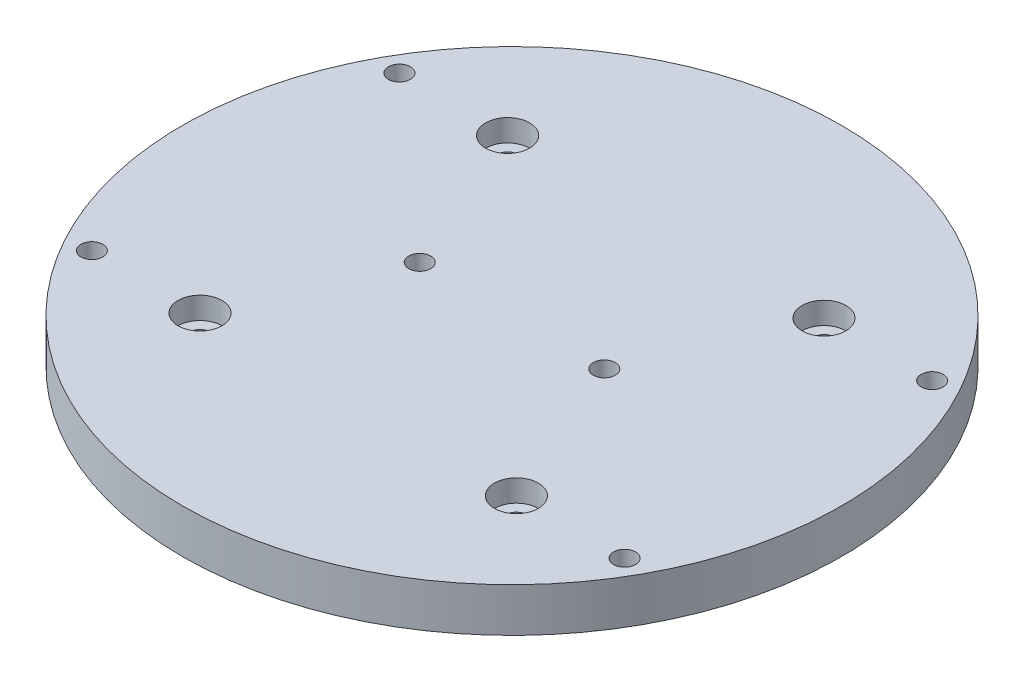
ISO-10303-21;
HEADER;
FILE_DESCRIPTION(('STEP AP214'),'2;1');
FILE_NAME('part.step','',(''),(''),'','','');
FILE_SCHEMA(('AUTOMOTIVE_DESIGN { 1 0 10303 214 1 1 1 1 }'));
ENDSEC;
DATA;
#1=APPLICATION_CONTEXT('core data for automotive mechanical design processes');
#2=APPLICATION_PROTOCOL_DEFINITION('international standard','automotive_design',2000,#1);
#3=PRODUCT_CONTEXT('',#1,'mechanical');
#4=PRODUCT('Part','Part','',(#3));
#5=PRODUCT_RELATED_PRODUCT_CATEGORY('part','',(#4));
#6=PRODUCT_DEFINITION_FORMATION('','',#4);
#7=PRODUCT_DEFINITION_CONTEXT('part definition',#1,'design');
#8=PRODUCT_DEFINITION('design','',#6,#7);
#9=PRODUCT_DEFINITION_SHAPE('','',#8);
#10=(LENGTH_UNIT() NAMED_UNIT(*) SI_UNIT(.MILLI.,.METRE.));
#11=(NAMED_UNIT(*) PLANE_ANGLE_UNIT() SI_UNIT($,.RADIAN.));
#12=(NAMED_UNIT(*) SI_UNIT($,.STERADIAN.) SOLID_ANGLE_UNIT());
#13=UNCERTAINTY_MEASURE_WITH_UNIT(LENGTH_MEASURE(1.E-05),#10,'distance_accuracy_value','');
#14=(GEOMETRIC_REPRESENTATION_CONTEXT(3) GLOBAL_UNCERTAINTY_ASSIGNED_CONTEXT((#13)) GLOBAL_UNIT_ASSIGNED_CONTEXT((#10,
#11,#12)) REPRESENTATION_CONTEXT('',''));
#15=CARTESIAN_POINT('',(0.,0.,0.));
#16=DIRECTION('',(0.,0.,1.));
#17=DIRECTION('',(1.,0.,0.));
#18=AXIS2_PLACEMENT_3D('',#15,#16,#17);
#19=CARTESIAN_POINT('',(36.,-17.,-35.));
#20=DIRECTION('',(0.,1.,0.));
#21=DIRECTION('',(0.,0.,1.));
#22=AXIS2_PLACEMENT_3D('',#19,#20,#21);
#23=CYLINDRICAL_SURFACE('',#22,2.5);
#24=CARTESIAN_POINT('',(36.,0.,-35.));
#25=DIRECTION('',(0.,1.,0.));
#26=DIRECTION('',(0.,0.,1.));
#27=AXIS2_PLACEMENT_3D('',#24,#25,#26);
#28=CIRCLE('',#27,2.5);
#29=CARTESIAN_POINT('',(36.,0.,-32.5));
#30=VERTEX_POINT('',#29);
#31=EDGE_CURVE('E61',#30,#30,#28,.T.);
#32=ORIENTED_EDGE('',*,*,#31,.F.);
#33=EDGE_LOOP('',(#32));
#34=FACE_BOUND('',#33,.T.);
#35=CARTESIAN_POINT('',(36.,5.,-35.));
#36=DIRECTION('',(0.,1.,0.));
#37=DIRECTION('',(0.,0.,1.));
#38=AXIS2_PLACEMENT_3D('',#35,#36,#37);
#39=CIRCLE('',#38,2.5);
#40=CARTESIAN_POINT('',(36.,5.,-32.5));
#41=VERTEX_POINT('',#40);
#42=EDGE_CURVE('E37',#41,#41,#39,.F.);
#43=ORIENTED_EDGE('',*,*,#42,.F.);
#44=EDGE_LOOP('',(#43));
#45=FACE_BOUND('',#44,.T.);
#46=ADVANCED_FACE('F33',(#34,#45),#23,.F.);
#47=CARTESIAN_POINT('',(36.,-17.,35.));
#48=DIRECTION('',(0.,1.,0.));
#49=DIRECTION('',(0.,0.,1.));
#50=AXIS2_PLACEMENT_3D('',#47,#48,#49);
#51=CYLINDRICAL_SURFACE('',#50,2.5);
#52=CARTESIAN_POINT('',(36.,0.,35.));
#53=DIRECTION('',(0.,1.,0.));
#54=DIRECTION('',(0.,0.,1.));
#55=AXIS2_PLACEMENT_3D('',#52,#53,#54);
#56=CIRCLE('',#55,2.5);
#57=CARTESIAN_POINT('',(36.,0.,37.5));
#58=VERTEX_POINT('',#57);
#59=EDGE_CURVE('E64',#58,#58,#56,.T.);
#60=ORIENTED_EDGE('',*,*,#59,.F.);
#61=EDGE_LOOP('',(#60));
#62=FACE_BOUND('',#61,.T.);
#63=CARTESIAN_POINT('',(36.,5.,35.));
#64=DIRECTION('',(0.,1.,0.));
#65=DIRECTION('',(0.,0.,1.));
#66=AXIS2_PLACEMENT_3D('',#63,#64,#65);
#67=CIRCLE('',#66,2.5);
#68=CARTESIAN_POINT('',(36.,5.,37.5));
#69=VERTEX_POINT('',#68);
#70=EDGE_CURVE('E87',#69,#69,#67,.F.);
#71=ORIENTED_EDGE('',*,*,#70,.F.);
#72=EDGE_LOOP('',(#71));
#73=FACE_BOUND('',#72,.T.);
#74=ADVANCED_FACE('F139',(#62,#73),#51,.F.);
#75=CARTESIAN_POINT('',(-36.,-17.,35.));
#76=DIRECTION('',(0.,1.,0.));
#77=DIRECTION('',(0.,0.,1.));
#78=AXIS2_PLACEMENT_3D('',#75,#76,#77);
#79=CYLINDRICAL_SURFACE('',#78,2.5);
#80=CARTESIAN_POINT('',(-36.,0.,35.));
#81=DIRECTION('',(0.,1.,0.));
#82=DIRECTION('',(0.,0.,1.));
#83=AXIS2_PLACEMENT_3D('',#80,#81,#82);
#84=CIRCLE('',#83,2.5);
#85=CARTESIAN_POINT('',(-36.,0.,37.5));
#86=VERTEX_POINT('',#85);
#87=EDGE_CURVE('E67',#86,#86,#84,.T.);
#88=ORIENTED_EDGE('',*,*,#87,.F.);
#89=EDGE_LOOP('',(#88));
#90=FACE_BOUND('',#89,.T.);
#91=CARTESIAN_POINT('',(-36.,5.,35.));
#92=DIRECTION('',(0.,1.,0.));
#93=DIRECTION('',(0.,0.,1.));
#94=AXIS2_PLACEMENT_3D('',#91,#92,#93);
#95=CIRCLE('',#94,2.5);
#96=CARTESIAN_POINT('',(-36.,5.,37.5));
#97=VERTEX_POINT('',#96);
#98=EDGE_CURVE('E84',#97,#97,#95,.F.);
#99=ORIENTED_EDGE('',*,*,#98,.F.);
#100=EDGE_LOOP('',(#99));
#101=FACE_BOUND('',#100,.T.);
#102=ADVANCED_FACE('F146',(#90,#101),#79,.F.);
#103=CARTESIAN_POINT('',(-36.,-17.,-35.));
#104=DIRECTION('',(0.,1.,0.));
#105=DIRECTION('',(0.,0.,1.));
#106=AXIS2_PLACEMENT_3D('',#103,#104,#105);
#107=CYLINDRICAL_SURFACE('',#106,2.5);
#108=CARTESIAN_POINT('',(-36.,0.,-35.));
#109=DIRECTION('',(0.,1.,0.));
#110=DIRECTION('',(0.,0.,1.));
#111=AXIS2_PLACEMENT_3D('',#108,#109,#110);
#112=CIRCLE('',#111,2.5);
#113=CARTESIAN_POINT('',(-36.,0.,-32.5));
#114=VERTEX_POINT('',#113);
#115=EDGE_CURVE('E70',#114,#114,#112,.T.);
#116=ORIENTED_EDGE('',*,*,#115,.F.);
#117=EDGE_LOOP('',(#116));
#118=FACE_BOUND('',#117,.T.);
#119=CARTESIAN_POINT('',(-36.,5.,-35.));
#120=DIRECTION('',(0.,1.,0.));
#121=DIRECTION('',(0.,0.,1.));
#122=AXIS2_PLACEMENT_3D('',#119,#120,#121);
#123=CIRCLE('',#122,2.5);
#124=CARTESIAN_POINT('',(-36.,5.,-32.5));
#125=VERTEX_POINT('',#124);
#126=EDGE_CURVE('E81',#125,#125,#123,.F.);
#127=ORIENTED_EDGE('',*,*,#126,.F.);
#128=EDGE_LOOP('',(#127));
#129=FACE_BOUND('',#128,.T.);
#130=ADVANCED_FACE('F133',(#118,#129),#107,.F.);
#131=CARTESIAN_POINT('',(0.,10.,0.));
#132=DIRECTION('',(0.,-1.,0.));
#133=DIRECTION('',(0.,0.,-1.));
#134=AXIS2_PLACEMENT_3D('',#131,#132,#133);
#135=CYLINDRICAL_SURFACE('',#134,75.);
#136=CARTESIAN_POINT('',(0.,10.,0.));
#137=DIRECTION('',(0.,1.,0.));
#138=DIRECTION('',(0.,0.,1.));
#139=AXIS2_PLACEMENT_3D('',#136,#137,#138);
#140=CIRCLE('',#139,75.);
#141=CARTESIAN_POINT('',(0.,10.,75.));
#142=VERTEX_POINT('',#141);
#143=EDGE_CURVE('E10',#142,#142,#140,.T.);
#144=ORIENTED_EDGE('',*,*,#143,.F.);
#145=EDGE_LOOP('',(#144));
#146=FACE_BOUND('',#145,.T.);
#147=CARTESIAN_POINT('',(0.,0.,0.));
#148=DIRECTION('',(0.,1.,0.));
#149=DIRECTION('',(0.,0.,1.));
#150=AXIS2_PLACEMENT_3D('',#147,#148,#149);
#151=CIRCLE('',#150,75.);
#152=CARTESIAN_POINT('',(0.,0.,75.));
#153=VERTEX_POINT('',#152);
#154=EDGE_CURVE('E41',#153,#153,#151,.T.);
#155=ORIENTED_EDGE('',*,*,#154,.T.);
#156=EDGE_LOOP('',(#155));
#157=FACE_BOUND('',#156,.T.);
#158=ADVANCED_FACE('F35',(#146,#157),#135,.T.);
#159=CARTESIAN_POINT('',(0.,10.,0.));
#160=DIRECTION('',(0.,1.,0.));
#161=DIRECTION('',(0.,0.,1.));
#162=AXIS2_PLACEMENT_3D('',#159,#160,#161);
#163=PLANE('',#162);
#164=CARTESIAN_POINT('',(-36.,10.,-35.));
#165=DIRECTION('',(0.,1.,0.));
#166=DIRECTION('',(0.,0.,1.));
#167=AXIS2_PLACEMENT_3D('',#164,#165,#166);
#168=CIRCLE('',#167,5.);
#169=CARTESIAN_POINT('',(-36.,10.,-30.));
#170=VERTEX_POINT('',#169);
#171=EDGE_CURVE('E251',#170,#170,#168,.T.);
#172=ORIENTED_EDGE('',*,*,#171,.F.);
#173=EDGE_LOOP('',(#172));
#174=FACE_BOUND('',#173,.T.);
#175=CARTESIAN_POINT('',(-36.,10.,35.));
#176=DIRECTION('',(0.,1.,0.));
#177=DIRECTION('',(0.,0.,1.));
#178=AXIS2_PLACEMENT_3D('',#175,#176,#177);
#179=CIRCLE('',#178,5.);
#180=CARTESIAN_POINT('',(-36.,10.,39.9999999999999));
#181=VERTEX_POINT('',#180);
#182=EDGE_CURVE('E257',#181,#181,#179,.T.);
#183=ORIENTED_EDGE('',*,*,#182,.F.);
#184=EDGE_LOOP('',(#183));
#185=FACE_BOUND('',#184,.T.);
#186=CARTESIAN_POINT('',(36.,10.,35.));
#187=DIRECTION('',(0.,1.,0.));
#188=DIRECTION('',(0.,0.,1.));
#189=AXIS2_PLACEMENT_3D('',#186,#187,#188);
#190=CIRCLE('',#189,5.);
#191=CARTESIAN_POINT('',(36.,10.,40.));
#192=VERTEX_POINT('',#191);
#193=EDGE_CURVE('E262',#192,#192,#190,.T.);
#194=ORIENTED_EDGE('',*,*,#193,.F.);
#195=EDGE_LOOP('',(#194));
#196=FACE_BOUND('',#195,.T.);
#197=CARTESIAN_POINT('',(36.,10.,-35.));
#198=DIRECTION('',(0.,1.,0.));
#199=DIRECTION('',(0.,0.,1.));
#200=AXIS2_PLACEMENT_3D('',#197,#198,#199);
#201=CIRCLE('',#200,5.);
#202=CARTESIAN_POINT('',(36.,10.,-30.));
#203=VERTEX_POINT('',#202);
#204=EDGE_CURVE('E105',#203,#203,#201,.T.);
#205=ORIENTED_EDGE('',*,*,#204,.F.);
#206=EDGE_LOOP('',(#205));
#207=FACE_BOUND('',#206,.T.);
#208=CARTESIAN_POINT('',(-60.6217782649107,10.,35.));
#209=DIRECTION('',(0.,1.,0.));
#210=DIRECTION('',(0.,0.,1.));
#211=AXIS2_PLACEMENT_3D('',#208,#209,#210);
#212=CIRCLE('',#211,2.5);
#213=CARTESIAN_POINT('',(-60.6217782649107,10.,37.5));
#214=VERTEX_POINT('',#213);
#215=EDGE_CURVE('E96',#214,#214,#212,.T.);
#216=ORIENTED_EDGE('',*,*,#215,.F.);
#217=EDGE_LOOP('',(#216));
#218=FACE_BOUND('',#217,.T.);
#219=CARTESIAN_POINT('',(60.6217782649107,10.,35.0000000000001));
#220=DIRECTION('',(0.,1.,0.));
#221=DIRECTION('',(0.,0.,-1.));
#222=AXIS2_PLACEMENT_3D('',#219,#220,#221);
#223=CIRCLE('',#222,2.5);
#224=CARTESIAN_POINT('',(60.6217782649107,10.,32.5000000000001));
#225=VERTEX_POINT('',#224);
#226=EDGE_CURVE('E101',#225,#225,#223,.T.);
#227=ORIENTED_EDGE('',*,*,#226,.F.);
#228=EDGE_LOOP('',(#227));
#229=FACE_BOUND('',#228,.T.);
#230=CARTESIAN_POINT('',(60.6217782649107,10.,-35.0000000000001));
#231=DIRECTION('',(0.,1.,0.));
#232=DIRECTION('',(0.,0.,1.));
#233=AXIS2_PLACEMENT_3D('',#230,#231,#232);
#234=CIRCLE('',#233,2.5);
#235=CARTESIAN_POINT('',(60.6217782649107,10.,-32.5000000000001));
#236=VERTEX_POINT('',#235);
#237=EDGE_CURVE('E107',#236,#236,#234,.T.);
#238=ORIENTED_EDGE('',*,*,#237,.F.);
#239=EDGE_LOOP('',(#238));
#240=FACE_BOUND('',#239,.T.);
#241=CARTESIAN_POINT('',(-21.,10.,0.));
#242=DIRECTION('',(0.,1.,0.));
#243=DIRECTION('',(0.,0.,1.));
#244=AXIS2_PLACEMENT_3D('',#241,#242,#243);
#245=CIRCLE('',#244,2.5);
#246=CARTESIAN_POINT('',(-21.,10.,2.5));
#247=VERTEX_POINT('',#246);
#248=EDGE_CURVE('E110',#247,#247,#245,.T.);
#249=ORIENTED_EDGE('',*,*,#248,.F.);
#250=EDGE_LOOP('',(#249));
#251=FACE_BOUND('',#250,.T.);
#252=CARTESIAN_POINT('',(-60.6217782649107,10.,-35.0000000000001));
#253=DIRECTION('',(0.,1.,0.));
#254=DIRECTION('',(0.,0.,-1.));
#255=AXIS2_PLACEMENT_3D('',#252,#253,#254);
#256=CIRCLE('',#255,2.5);
#257=CARTESIAN_POINT('',(-60.6217782649107,10.,-37.5000000000001));
#258=VERTEX_POINT('',#257);
#259=EDGE_CURVE('E92',#258,#258,#256,.T.);
#260=ORIENTED_EDGE('',*,*,#259,.F.);
#261=EDGE_LOOP('',(#260));
#262=FACE_BOUND('',#261,.T.);
#263=CARTESIAN_POINT('',(21.,10.,0.));
#264=DIRECTION('',(0.,1.,0.));
#265=DIRECTION('',(0.,0.,1.));
#266=AXIS2_PLACEMENT_3D('',#263,#264,#265);
#267=CIRCLE('',#266,2.5);
#268=CARTESIAN_POINT('',(21.,10.,2.49999999999999));
#269=VERTEX_POINT('',#268);
#270=EDGE_CURVE('E49',#269,#269,#267,.T.);
#271=ORIENTED_EDGE('',*,*,#270,.F.);
#272=EDGE_LOOP('',(#271));
#273=FACE_BOUND('',#272,.T.);
#274=ORIENTED_EDGE('',*,*,#143,.T.);
#275=EDGE_LOOP('',(#274));
#276=FACE_BOUND('',#275,.T.);
#277=ADVANCED_FACE('F121',(#174,#185,#196,#207,#218,#229,#240,#251,#262,#273,#276),#163,.T.);
#278=CARTESIAN_POINT('',(0.,0.,0.));
#279=DIRECTION('',(0.,1.,0.));
#280=DIRECTION('',(0.,0.,1.));
#281=AXIS2_PLACEMENT_3D('',#278,#279,#280);
#282=PLANE('',#281);
#283=CARTESIAN_POINT('',(-60.6217782649107,0.,35.));
#284=DIRECTION('',(0.,1.,0.));
#285=DIRECTION('',(0.,0.,1.));
#286=AXIS2_PLACEMENT_3D('',#283,#284,#285);
#287=CIRCLE('',#286,2.5);
#288=CARTESIAN_POINT('',(-60.6217782649107,0.,37.5));
#289=VERTEX_POINT('',#288);
#290=EDGE_CURVE('E46',#289,#289,#287,.T.);
#291=ORIENTED_EDGE('',*,*,#290,.T.);
#292=EDGE_LOOP('',(#291));
#293=FACE_BOUND('',#292,.T.);
#294=CARTESIAN_POINT('',(60.6217782649107,0.,35.0000000000001));
#295=DIRECTION('',(0.,1.,0.));
#296=DIRECTION('',(0.,0.,1.));
#297=AXIS2_PLACEMENT_3D('',#294,#295,#296);
#298=CIRCLE('',#297,2.5);
#299=CARTESIAN_POINT('',(60.6217782649107,0.,37.5000000000001));
#300=VERTEX_POINT('',#299);
#301=EDGE_CURVE('E76',#300,#300,#298,.T.);
#302=ORIENTED_EDGE('',*,*,#301,.T.);
#303=EDGE_LOOP('',(#302));
#304=FACE_BOUND('',#303,.T.);
#305=CARTESIAN_POINT('',(60.6217782649107,0.,-35.0000000000001));
#306=DIRECTION('',(0.,1.,0.));
#307=DIRECTION('',(0.,0.,1.));
#308=AXIS2_PLACEMENT_3D('',#305,#306,#307);
#309=CIRCLE('',#308,2.5);
#310=CARTESIAN_POINT('',(60.6217782649107,0.,-32.5000000000001));
#311=VERTEX_POINT('',#310);
#312=EDGE_CURVE('E73',#311,#311,#309,.T.);
#313=ORIENTED_EDGE('',*,*,#312,.T.);
#314=EDGE_LOOP('',(#313));
#315=FACE_BOUND('',#314,.T.);
#316=ORIENTED_EDGE('',*,*,#115,.T.);
#317=EDGE_LOOP('',(#316));
#318=FACE_BOUND('',#317,.T.);
#319=ORIENTED_EDGE('',*,*,#87,.T.);
#320=EDGE_LOOP('',(#319));
#321=FACE_BOUND('',#320,.T.);
#322=ORIENTED_EDGE('',*,*,#59,.T.);
#323=EDGE_LOOP('',(#322));
#324=FACE_BOUND('',#323,.T.);
#325=ORIENTED_EDGE('',*,*,#31,.T.);
#326=EDGE_LOOP('',(#325));
#327=FACE_BOUND('',#326,.T.);
#328=CARTESIAN_POINT('',(-21.,0.,0.));
#329=DIRECTION('',(0.,1.,0.));
#330=DIRECTION('',(0.,0.,1.));
#331=AXIS2_PLACEMENT_3D('',#328,#329,#330);
#332=CIRCLE('',#331,2.5);
#333=CARTESIAN_POINT('',(-21.,0.,2.5));
#334=VERTEX_POINT('',#333);
#335=EDGE_CURVE('E58',#334,#334,#332,.T.);
#336=ORIENTED_EDGE('',*,*,#335,.T.);
#337=EDGE_LOOP('',(#336));
#338=FACE_BOUND('',#337,.T.);
#339=CARTESIAN_POINT('',(-60.6217782649107,0.,-35.0000000000001));
#340=DIRECTION('',(0.,1.,0.));
#341=DIRECTION('',(0.,0.,1.));
#342=AXIS2_PLACEMENT_3D('',#339,#340,#341);
#343=CIRCLE('',#342,2.5);
#344=CARTESIAN_POINT('',(-60.6217782649107,0.,-32.5000000000001));
#345=VERTEX_POINT('',#344);
#346=EDGE_CURVE('E55',#345,#345,#343,.T.);
#347=ORIENTED_EDGE('',*,*,#346,.T.);
#348=EDGE_LOOP('',(#347));
#349=FACE_BOUND('',#348,.T.);
#350=CARTESIAN_POINT('',(21.,0.,0.));
#351=DIRECTION('',(0.,1.,0.));
#352=DIRECTION('',(0.,0.,1.));
#353=AXIS2_PLACEMENT_3D('',#350,#351,#352);
#354=CIRCLE('',#353,2.5);
#355=CARTESIAN_POINT('',(21.,0.,2.49999999999999));
#356=VERTEX_POINT('',#355);
#357=EDGE_CURVE('E52',#356,#356,#354,.T.);
#358=ORIENTED_EDGE('',*,*,#357,.T.);
#359=EDGE_LOOP('',(#358));
#360=FACE_BOUND('',#359,.T.);
#361=ORIENTED_EDGE('',*,*,#154,.F.);
#362=EDGE_LOOP('',(#361));
#363=FACE_BOUND('',#362,.T.);
#364=ADVANCED_FACE('F123',(#293,#304,#315,#318,#321,#324,#327,#338,#349,#360,#363),#282,.F.);
#365=CARTESIAN_POINT('',(21.,-17.,0.));
#366=DIRECTION('',(0.,1.,0.));
#367=DIRECTION('',(0.,0.,1.));
#368=AXIS2_PLACEMENT_3D('',#365,#366,#367);
#369=CYLINDRICAL_SURFACE('',#368,2.5);
#370=ORIENTED_EDGE('',*,*,#270,.T.);
#371=EDGE_LOOP('',(#370));
#372=FACE_BOUND('',#371,.T.);
#373=ORIENTED_EDGE('',*,*,#357,.F.);
#374=EDGE_LOOP('',(#373));
#375=FACE_BOUND('',#374,.T.);
#376=ADVANCED_FACE('F118',(#372,#375),#369,.F.);
#377=CARTESIAN_POINT('',(-60.6217782649107,-17.,-35.0000000000001));
#378=DIRECTION('',(0.,1.,0.));
#379=DIRECTION('',(0.,0.,1.));
#380=AXIS2_PLACEMENT_3D('',#377,#378,#379);
#381=CYLINDRICAL_SURFACE('',#380,2.5);
#382=ORIENTED_EDGE('',*,*,#259,.T.);
#383=EDGE_LOOP('',(#382));
#384=FACE_BOUND('',#383,.T.);
#385=ORIENTED_EDGE('',*,*,#346,.F.);
#386=EDGE_LOOP('',(#385));
#387=FACE_BOUND('',#386,.T.);
#388=ADVANCED_FACE('F158',(#384,#387),#381,.F.);
#389=CARTESIAN_POINT('',(-21.,-17.,0.));
#390=DIRECTION('',(0.,1.,0.));
#391=DIRECTION('',(0.,0.,1.));
#392=AXIS2_PLACEMENT_3D('',#389,#390,#391);
#393=CYLINDRICAL_SURFACE('',#392,2.5);
#394=ORIENTED_EDGE('',*,*,#248,.T.);
#395=EDGE_LOOP('',(#394));
#396=FACE_BOUND('',#395,.T.);
#397=ORIENTED_EDGE('',*,*,#335,.F.);
#398=EDGE_LOOP('',(#397));
#399=FACE_BOUND('',#398,.T.);
#400=ADVANCED_FACE('F152',(#396,#399),#393,.F.);
#401=CARTESIAN_POINT('',(60.6217782649107,-17.,-35.0000000000001));
#402=DIRECTION('',(0.,1.,0.));
#403=DIRECTION('',(0.,0.,1.));
#404=AXIS2_PLACEMENT_3D('',#401,#402,#403);
#405=CYLINDRICAL_SURFACE('',#404,2.5);
#406=ORIENTED_EDGE('',*,*,#237,.T.);
#407=EDGE_LOOP('',(#406));
#408=FACE_BOUND('',#407,.T.);
#409=ORIENTED_EDGE('',*,*,#312,.F.);
#410=EDGE_LOOP('',(#409));
#411=FACE_BOUND('',#410,.T.);
#412=ADVANCED_FACE('F167',(#408,#411),#405,.F.);
#413=CARTESIAN_POINT('',(60.6217782649107,-17.,35.0000000000001));
#414=DIRECTION('',(0.,1.,0.));
#415=DIRECTION('',(0.,0.,1.));
#416=AXIS2_PLACEMENT_3D('',#413,#414,#415);
#417=CYLINDRICAL_SURFACE('',#416,2.5);
#418=ORIENTED_EDGE('',*,*,#226,.T.);
#419=EDGE_LOOP('',(#418));
#420=FACE_BOUND('',#419,.T.);
#421=ORIENTED_EDGE('',*,*,#301,.F.);
#422=EDGE_LOOP('',(#421));
#423=FACE_BOUND('',#422,.T.);
#424=ADVANCED_FACE('F177',(#420,#423),#417,.F.);
#425=CARTESIAN_POINT('',(-60.6217782649107,-17.,35.));
#426=DIRECTION('',(0.,1.,0.));
#427=DIRECTION('',(0.,0.,1.));
#428=AXIS2_PLACEMENT_3D('',#425,#426,#427);
#429=CYLINDRICAL_SURFACE('',#428,2.5);
#430=ORIENTED_EDGE('',*,*,#215,.T.);
#431=EDGE_LOOP('',(#430));
#432=FACE_BOUND('',#431,.T.);
#433=ORIENTED_EDGE('',*,*,#290,.F.);
#434=EDGE_LOOP('',(#433));
#435=FACE_BOUND('',#434,.T.);
#436=ADVANCED_FACE('F180',(#432,#435),#429,.F.);
#437=CARTESIAN_POINT('',(-36.,5.,-35.));
#438=DIRECTION('',(0.,1.,0.));
#439=DIRECTION('',(0.,0.,1.));
#440=AXIS2_PLACEMENT_3D('',#437,#438,#439);
#441=PLANE('',#440);
#442=CARTESIAN_POINT('',(-36.,5.,-35.));
#443=DIRECTION('',(0.,1.,0.));
#444=DIRECTION('',(0.,0.,1.));
#445=AXIS2_PLACEMENT_3D('',#442,#443,#444);
#446=CIRCLE('',#445,5.);
#447=CARTESIAN_POINT('',(-36.,5.,-30.));
#448=VERTEX_POINT('',#447);
#449=EDGE_CURVE('E254',#448,#448,#446,.T.);
#450=ORIENTED_EDGE('',*,*,#449,.T.);
#451=EDGE_LOOP('',(#450));
#452=FACE_BOUND('',#451,.T.);
#453=ORIENTED_EDGE('',*,*,#126,.T.);
#454=EDGE_LOOP('',(#453));
#455=FACE_BOUND('',#454,.T.);
#456=ADVANCED_FACE('F183',(#452,#455),#441,.T.);
#457=CARTESIAN_POINT('',(-36.,5.,-35.));
#458=DIRECTION('',(0.,1.,0.));
#459=DIRECTION('',(0.,0.,1.));
#460=AXIS2_PLACEMENT_3D('',#457,#458,#459);
#461=CYLINDRICAL_SURFACE('',#460,5.);
#462=ORIENTED_EDGE('',*,*,#449,.F.);
#463=EDGE_LOOP('',(#462));
#464=FACE_BOUND('',#463,.T.);
#465=ORIENTED_EDGE('',*,*,#171,.T.);
#466=EDGE_LOOP('',(#465));
#467=FACE_BOUND('',#466,.T.);
#468=ADVANCED_FACE('F188',(#464,#467),#461,.F.);
#469=CARTESIAN_POINT('',(-36.,5.,35.));
#470=DIRECTION('',(0.,1.,0.));
#471=DIRECTION('',(0.,0.,1.));
#472=AXIS2_PLACEMENT_3D('',#469,#470,#471);
#473=PLANE('',#472);
#474=CARTESIAN_POINT('',(-36.,5.,35.));
#475=DIRECTION('',(0.,1.,0.));
#476=DIRECTION('',(0.,0.,1.));
#477=AXIS2_PLACEMENT_3D('',#474,#475,#476);
#478=CIRCLE('',#477,5.);
#479=CARTESIAN_POINT('',(-36.,5.,39.9999999999999));
#480=VERTEX_POINT('',#479);
#481=EDGE_CURVE('E260',#480,#480,#478,.T.);
#482=ORIENTED_EDGE('',*,*,#481,.T.);
#483=EDGE_LOOP('',(#482));
#484=FACE_BOUND('',#483,.T.);
#485=ORIENTED_EDGE('',*,*,#98,.T.);
#486=EDGE_LOOP('',(#485));
#487=FACE_BOUND('',#486,.T.);
#488=ADVANCED_FACE('F219',(#484,#487),#473,.T.);
#489=CARTESIAN_POINT('',(-36.,5.,35.));
#490=DIRECTION('',(0.,1.,0.));
#491=DIRECTION('',(0.,0.,1.));
#492=AXIS2_PLACEMENT_3D('',#489,#490,#491);
#493=CYLINDRICAL_SURFACE('',#492,5.);
#494=ORIENTED_EDGE('',*,*,#481,.F.);
#495=EDGE_LOOP('',(#494));
#496=FACE_BOUND('',#495,.T.);
#497=ORIENTED_EDGE('',*,*,#182,.T.);
#498=EDGE_LOOP('',(#497));
#499=FACE_BOUND('',#498,.T.);
#500=ADVANCED_FACE('F221',(#496,#499),#493,.F.);
#501=CARTESIAN_POINT('',(36.,5.,35.));
#502=DIRECTION('',(0.,1.,0.));
#503=DIRECTION('',(0.,0.,1.));
#504=AXIS2_PLACEMENT_3D('',#501,#502,#503);
#505=PLANE('',#504);
#506=CARTESIAN_POINT('',(36.,5.,35.));
#507=DIRECTION('',(0.,1.,0.));
#508=DIRECTION('',(0.,0.,1.));
#509=AXIS2_PLACEMENT_3D('',#506,#507,#508);
#510=CIRCLE('',#509,5.);
#511=CARTESIAN_POINT('',(36.,5.,40.));
#512=VERTEX_POINT('',#511);
#513=EDGE_CURVE('E249',#512,#512,#510,.T.);
#514=ORIENTED_EDGE('',*,*,#513,.T.);
#515=EDGE_LOOP('',(#514));
#516=FACE_BOUND('',#515,.T.);
#517=ORIENTED_EDGE('',*,*,#70,.T.);
#518=EDGE_LOOP('',(#517));
#519=FACE_BOUND('',#518,.T.);
#520=ADVANCED_FACE('F228',(#516,#519),#505,.T.);
#521=CARTESIAN_POINT('',(36.,5.,35.));
#522=DIRECTION('',(0.,1.,0.));
#523=DIRECTION('',(0.,0.,1.));
#524=AXIS2_PLACEMENT_3D('',#521,#522,#523);
#525=CYLINDRICAL_SURFACE('',#524,5.);
#526=ORIENTED_EDGE('',*,*,#513,.F.);
#527=EDGE_LOOP('',(#526));
#528=FACE_BOUND('',#527,.T.);
#529=ORIENTED_EDGE('',*,*,#193,.T.);
#530=EDGE_LOOP('',(#529));
#531=FACE_BOUND('',#530,.T.);
#532=ADVANCED_FACE('F235',(#528,#531),#525,.F.);
#533=CARTESIAN_POINT('',(36.,5.,-35.));
#534=DIRECTION('',(0.,1.,0.));
#535=DIRECTION('',(0.,0.,1.));
#536=AXIS2_PLACEMENT_3D('',#533,#534,#535);
#537=PLANE('',#536);
#538=CARTESIAN_POINT('',(36.,5.,-35.));
#539=DIRECTION('',(0.,1.,0.));
#540=DIRECTION('',(0.,0.,1.));
#541=AXIS2_PLACEMENT_3D('',#538,#539,#540);
#542=CIRCLE('',#541,5.);
#543=CARTESIAN_POINT('',(36.,5.,-30.));
#544=VERTEX_POINT('',#543);
#545=EDGE_CURVE('E85',#544,#544,#542,.T.);
#546=ORIENTED_EDGE('',*,*,#545,.T.);
#547=EDGE_LOOP('',(#546));
#548=FACE_BOUND('',#547,.T.);
#549=ORIENTED_EDGE('',*,*,#42,.T.);
#550=EDGE_LOOP('',(#549));
#551=FACE_BOUND('',#550,.T.);
#552=ADVANCED_FACE('F237',(#548,#551),#537,.T.);
#553=CARTESIAN_POINT('',(36.,5.,-35.));
#554=DIRECTION('',(0.,1.,0.));
#555=DIRECTION('',(0.,0.,1.));
#556=AXIS2_PLACEMENT_3D('',#553,#554,#555);
#557=CYLINDRICAL_SURFACE('',#556,5.);
#558=ORIENTED_EDGE('',*,*,#545,.F.);
#559=EDGE_LOOP('',(#558));
#560=FACE_BOUND('',#559,.T.);
#561=ORIENTED_EDGE('',*,*,#204,.T.);
#562=EDGE_LOOP('',(#561));
#563=FACE_BOUND('',#562,.T.);
#564=ADVANCED_FACE('F171',(#560,#563),#557,.F.);
#565=CLOSED_SHELL('',(#46,#74,#102,#130,#158,#277,#364,#376,#388,#400,#412,#424,#436,#456,#468,
#488,#500,#520,#532,#552,#564));
#566=MANIFOLD_SOLID_BREP('B2',#565);
#567=ADVANCED_BREP_SHAPE_REPRESENTATION('',(#18,#566),#14);
#568=SHAPE_DEFINITION_REPRESENTATION(#9,#567);
ENDSEC;
END-ISO-10303-21;
